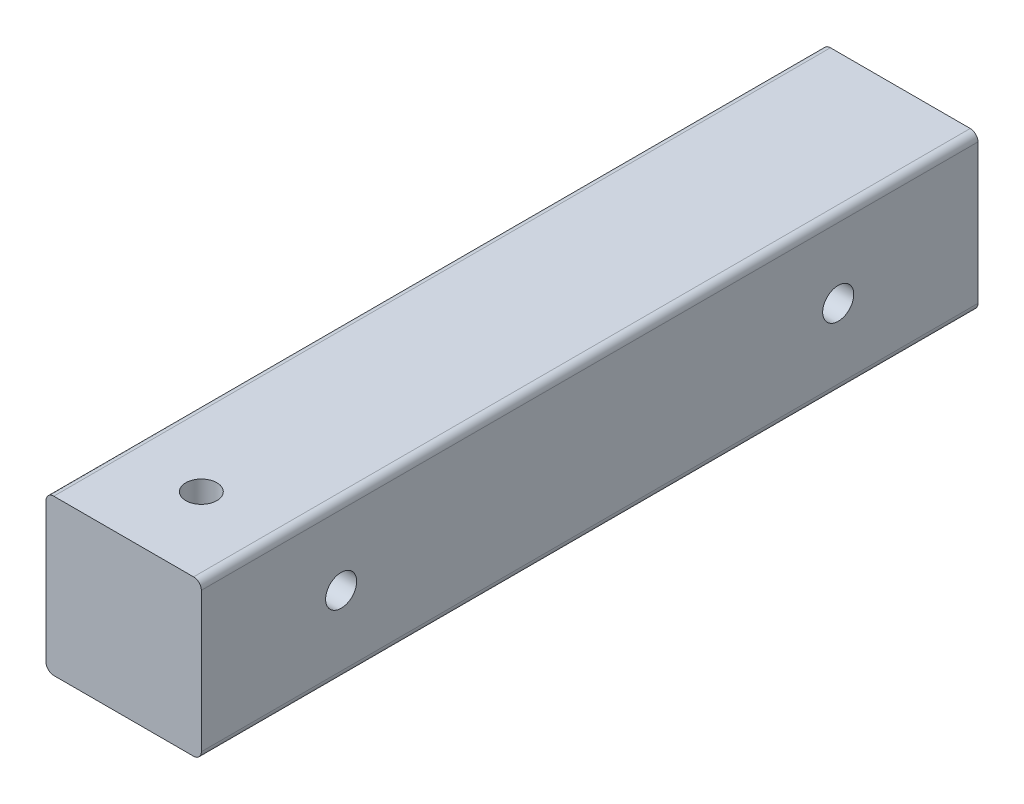
ISO-10303-21;
HEADER;
FILE_DESCRIPTION(('STEP AP214'),'2;1');
FILE_NAME('part.step','',(''),(''),'','','');
FILE_SCHEMA(('AUTOMOTIVE_DESIGN { 1 0 10303 214 1 1 1 1 }'));
ENDSEC;
DATA;
#1=APPLICATION_CONTEXT('core data for automotive mechanical design processes');
#2=APPLICATION_PROTOCOL_DEFINITION('international standard','automotive_design',2000,#1);
#3=PRODUCT_CONTEXT('',#1,'mechanical');
#4=PRODUCT('Part','Part','',(#3));
#5=PRODUCT_RELATED_PRODUCT_CATEGORY('part','',(#4));
#6=PRODUCT_DEFINITION_FORMATION('','',#4);
#7=PRODUCT_DEFINITION_CONTEXT('part definition',#1,'design');
#8=PRODUCT_DEFINITION('design','',#6,#7);
#9=PRODUCT_DEFINITION_SHAPE('','',#8);
#10=(LENGTH_UNIT() NAMED_UNIT(*) SI_UNIT(.MILLI.,.METRE.));
#11=(NAMED_UNIT(*) PLANE_ANGLE_UNIT() SI_UNIT($,.RADIAN.));
#12=(NAMED_UNIT(*) SI_UNIT($,.STERADIAN.) SOLID_ANGLE_UNIT());
#13=UNCERTAINTY_MEASURE_WITH_UNIT(LENGTH_MEASURE(1.E-05),#10,'distance_accuracy_value','');
#14=(GEOMETRIC_REPRESENTATION_CONTEXT(3) GLOBAL_UNCERTAINTY_ASSIGNED_CONTEXT((#13)) GLOBAL_UNIT_ASSIGNED_CONTEXT((#10,
#11,#12)) REPRESENTATION_CONTEXT('',''));
#15=CARTESIAN_POINT('',(0.,0.,0.));
#16=DIRECTION('',(0.,0.,1.));
#17=DIRECTION('',(1.,0.,0.));
#18=AXIS2_PLACEMENT_3D('',#15,#16,#17);
#19=CARTESIAN_POINT('',(0.,0.,100.));
#20=DIRECTION('',(1.,0.,0.));
#21=DIRECTION('',(0.,0.,-1.));
#22=AXIS2_PLACEMENT_3D('',#19,#20,#21);
#23=PLANE('',#22);
#24=CARTESIAN_POINT('',(0.,10.,18.));
#25=DIRECTION('',(1.,0.,0.));
#26=DIRECTION('',(0.,0.,-1.));
#27=AXIS2_PLACEMENT_3D('',#24,#25,#26);
#28=CIRCLE('',#27,2.);
#29=CARTESIAN_POINT('',(0.,10.,16.));
#30=VERTEX_POINT('',#29);
#31=EDGE_CURVE('E135',#30,#30,#28,.T.);
#32=ORIENTED_EDGE('',*,*,#31,.T.);
#33=EDGE_LOOP('',(#32));
#34=FACE_BOUND('',#33,.T.);
#35=CARTESIAN_POINT('',(0.,10.,82.));
#36=DIRECTION('',(1.,0.,0.));
#37=DIRECTION('',(0.,0.,-1.));
#38=AXIS2_PLACEMENT_3D('',#35,#36,#37);
#39=CIRCLE('',#38,2.);
#40=CARTESIAN_POINT('',(0.,10.,80.));
#41=VERTEX_POINT('',#40);
#42=EDGE_CURVE('E213',#41,#41,#39,.T.);
#43=ORIENTED_EDGE('',*,*,#42,.T.);
#44=EDGE_LOOP('',(#43));
#45=FACE_BOUND('',#44,.T.);
#46=DIRECTION('',(0.,-1.,0.));
#47=VECTOR('',#46,1.);
#48=CARTESIAN_POINT('',(0.,0.,100.));
#49=LINE('',#48,#47);
#50=CARTESIAN_POINT('',(0.,19.,100.));
#51=VERTEX_POINT('',#50);
#52=CARTESIAN_POINT('',(0.,1.,100.));
#53=VERTEX_POINT('',#52);
#54=EDGE_CURVE('E126',#51,#53,#49,.T.);
#55=ORIENTED_EDGE('',*,*,#54,.F.);
#56=DIRECTION('',(0.,0.,-1.));
#57=VECTOR('',#56,1.);
#58=CARTESIAN_POINT('',(0.,19.,100.));
#59=LINE('',#58,#57);
#60=CARTESIAN_POINT('',(0.,19.,0.));
#61=VERTEX_POINT('',#60);
#62=EDGE_CURVE('E110',#51,#61,#59,.T.);
#63=ORIENTED_EDGE('',*,*,#62,.T.);
#64=DIRECTION('',(0.,-1.,0.));
#65=VECTOR('',#64,1.);
#66=CARTESIAN_POINT('',(0.,0.,0.));
#67=LINE('',#66,#65);
#68=CARTESIAN_POINT('',(0.,1.,0.));
#69=VERTEX_POINT('',#68);
#70=EDGE_CURVE('E123',#61,#69,#67,.T.);
#71=ORIENTED_EDGE('',*,*,#70,.T.);
#72=DIRECTION('',(0.,0.,-1.));
#73=VECTOR('',#72,1.);
#74=CARTESIAN_POINT('',(0.,1.,100.));
#75=LINE('',#74,#73);
#76=EDGE_CURVE('E129',#69,#53,#75,.F.);
#77=ORIENTED_EDGE('',*,*,#76,.T.);
#78=EDGE_LOOP('',(#55,#63,#71,#77));
#79=FACE_BOUND('',#78,.T.);
#80=ADVANCED_FACE('F39',(#34,#45,#79),#23,.F.);
#81=CARTESIAN_POINT('',(0.,0.,100.));
#82=DIRECTION('',(0.,1.,0.));
#83=DIRECTION('',(0.,0.,1.));
#84=AXIS2_PLACEMENT_3D('',#81,#82,#83);
#85=PLANE('',#84);
#86=CARTESIAN_POINT('',(10.,0.,90.));
#87=DIRECTION('',(0.,-1.,0.));
#88=DIRECTION('',(0.,0.,-1.));
#89=AXIS2_PLACEMENT_3D('',#86,#87,#88);
#90=CIRCLE('',#89,2.);
#91=CARTESIAN_POINT('',(10.,0.,88.));
#92=VERTEX_POINT('',#91);
#93=EDGE_CURVE('E221',#92,#92,#90,.T.);
#94=ORIENTED_EDGE('',*,*,#93,.F.);
#95=EDGE_LOOP('',(#94));
#96=FACE_BOUND('',#95,.T.);
#97=DIRECTION('',(1.,0.,0.));
#98=VECTOR('',#97,1.);
#99=CARTESIAN_POINT('',(0.,0.,0.));
#100=LINE('',#99,#98);
#101=CARTESIAN_POINT('',(1.,0.,0.));
#102=VERTEX_POINT('',#101);
#103=CARTESIAN_POINT('',(19.,0.,0.));
#104=VERTEX_POINT('',#103);
#105=EDGE_CURVE('E134',#102,#104,#100,.T.);
#106=ORIENTED_EDGE('',*,*,#105,.T.);
#107=DIRECTION('',(0.,0.,-1.));
#108=VECTOR('',#107,1.);
#109=CARTESIAN_POINT('',(19.,0.,100.));
#110=LINE('',#109,#108);
#111=CARTESIAN_POINT('',(19.,0.,100.));
#112=VERTEX_POINT('',#111);
#113=EDGE_CURVE('E11',#104,#112,#110,.F.);
#114=ORIENTED_EDGE('',*,*,#113,.T.);
#115=DIRECTION('',(1.,0.,0.));
#116=VECTOR('',#115,1.);
#117=CARTESIAN_POINT('',(0.,0.,100.));
#118=LINE('',#117,#116);
#119=CARTESIAN_POINT('',(1.,0.,100.));
#120=VERTEX_POINT('',#119);
#121=EDGE_CURVE('E191',#120,#112,#118,.T.);
#122=ORIENTED_EDGE('',*,*,#121,.F.);
#123=DIRECTION('',(0.,0.,-1.));
#124=VECTOR('',#123,1.);
#125=CARTESIAN_POINT('',(1.,0.,100.));
#126=LINE('',#125,#124);
#127=EDGE_CURVE('E48',#120,#102,#126,.T.);
#128=ORIENTED_EDGE('',*,*,#127,.T.);
#129=EDGE_LOOP('',(#106,#114,#122,#128));
#130=FACE_BOUND('',#129,.T.);
#131=ADVANCED_FACE('F189',(#96,#130),#85,.F.);
#132=CARTESIAN_POINT('',(20.,0.,100.));
#133=DIRECTION('',(-1.,0.,0.));
#134=DIRECTION('',(0.,0.,1.));
#135=AXIS2_PLACEMENT_3D('',#132,#133,#134);
#136=PLANE('',#135);
#137=CARTESIAN_POINT('',(20.,10.,18.));
#138=DIRECTION('',(1.,0.,0.));
#139=DIRECTION('',(0.,0.,-1.));
#140=AXIS2_PLACEMENT_3D('',#137,#138,#139);
#141=CIRCLE('',#140,2.);
#142=CARTESIAN_POINT('',(20.,10.,16.));
#143=VERTEX_POINT('',#142);
#144=EDGE_CURVE('E143',#143,#143,#141,.T.);
#145=ORIENTED_EDGE('',*,*,#144,.F.);
#146=EDGE_LOOP('',(#145));
#147=FACE_BOUND('',#146,.T.);
#148=CARTESIAN_POINT('',(20.,10.,82.));
#149=DIRECTION('',(1.,0.,0.));
#150=DIRECTION('',(0.,0.,-1.));
#151=AXIS2_PLACEMENT_3D('',#148,#149,#150);
#152=CIRCLE('',#151,2.);
#153=CARTESIAN_POINT('',(20.,10.,80.));
#154=VERTEX_POINT('',#153);
#155=EDGE_CURVE('E209',#154,#154,#152,.T.);
#156=ORIENTED_EDGE('',*,*,#155,.F.);
#157=EDGE_LOOP('',(#156));
#158=FACE_BOUND('',#157,.T.);
#159=DIRECTION('',(0.,1.,0.));
#160=VECTOR('',#159,1.);
#161=CARTESIAN_POINT('',(20.,0.,0.));
#162=LINE('',#161,#160);
#163=CARTESIAN_POINT('',(20.,1.,0.));
#164=VERTEX_POINT('',#163);
#165=CARTESIAN_POINT('',(20.,19.,0.));
#166=VERTEX_POINT('',#165);
#167=EDGE_CURVE('E140',#164,#166,#162,.T.);
#168=ORIENTED_EDGE('',*,*,#167,.T.);
#169=DIRECTION('',(0.,0.,-1.));
#170=VECTOR('',#169,1.);
#171=CARTESIAN_POINT('',(20.,19.,100.));
#172=LINE('',#171,#170);
#173=CARTESIAN_POINT('',(20.,19.,100.));
#174=VERTEX_POINT('',#173);
#175=EDGE_CURVE('E55',#166,#174,#172,.F.);
#176=ORIENTED_EDGE('',*,*,#175,.T.);
#177=DIRECTION('',(0.,1.,0.));
#178=VECTOR('',#177,1.);
#179=CARTESIAN_POINT('',(20.,0.,100.));
#180=LINE('',#179,#178);
#181=CARTESIAN_POINT('',(20.,1.,100.));
#182=VERTEX_POINT('',#181);
#183=EDGE_CURVE('E199',#182,#174,#180,.T.);
#184=ORIENTED_EDGE('',*,*,#183,.F.);
#185=DIRECTION('',(0.,0.,-1.));
#186=VECTOR('',#185,1.);
#187=CARTESIAN_POINT('',(20.,1.,100.));
#188=LINE('',#187,#186);
#189=EDGE_CURVE('E179',#182,#164,#188,.T.);
#190=ORIENTED_EDGE('',*,*,#189,.T.);
#191=EDGE_LOOP('',(#168,#176,#184,#190));
#192=FACE_BOUND('',#191,.T.);
#193=ADVANCED_FACE('F198',(#147,#158,#192),#136,.F.);
#194=CARTESIAN_POINT('',(0.,20.,100.));
#195=DIRECTION('',(0.,-1.,0.));
#196=DIRECTION('',(0.,0.,-1.));
#197=AXIS2_PLACEMENT_3D('',#194,#195,#196);
#198=PLANE('',#197);
#199=CARTESIAN_POINT('',(10.,20.,90.));
#200=DIRECTION('',(0.,-1.,0.));
#201=DIRECTION('',(0.,0.,-1.));
#202=AXIS2_PLACEMENT_3D('',#199,#200,#201);
#203=CIRCLE('',#202,2.);
#204=CARTESIAN_POINT('',(10.,20.,88.));
#205=VERTEX_POINT('',#204);
#206=EDGE_CURVE('E214',#205,#205,#203,.T.);
#207=ORIENTED_EDGE('',*,*,#206,.T.);
#208=EDGE_LOOP('',(#207));
#209=FACE_BOUND('',#208,.T.);
#210=DIRECTION('',(-1.,0.,0.));
#211=VECTOR('',#210,1.);
#212=CARTESIAN_POINT('',(0.,20.,0.));
#213=LINE('',#212,#211);
#214=CARTESIAN_POINT('',(19.,20.,0.));
#215=VERTEX_POINT('',#214);
#216=CARTESIAN_POINT('',(1.,20.,0.));
#217=VERTEX_POINT('',#216);
#218=EDGE_CURVE('E151',#215,#217,#213,.T.);
#219=ORIENTED_EDGE('',*,*,#218,.T.);
#220=DIRECTION('',(0.,0.,-1.));
#221=VECTOR('',#220,1.);
#222=CARTESIAN_POINT('',(1.,20.,100.));
#223=LINE('',#222,#221);
#224=CARTESIAN_POINT('',(1.,20.,100.));
#225=VERTEX_POINT('',#224);
#226=EDGE_CURVE('E111',#217,#225,#223,.F.);
#227=ORIENTED_EDGE('',*,*,#226,.T.);
#228=DIRECTION('',(-1.,0.,0.));
#229=VECTOR('',#228,1.);
#230=CARTESIAN_POINT('',(0.,20.,100.));
#231=LINE('',#230,#229);
#232=CARTESIAN_POINT('',(19.,20.,100.));
#233=VERTEX_POINT('',#232);
#234=EDGE_CURVE('E146',#233,#225,#231,.T.);
#235=ORIENTED_EDGE('',*,*,#234,.F.);
#236=DIRECTION('',(0.,0.,-1.));
#237=VECTOR('',#236,1.);
#238=CARTESIAN_POINT('',(19.,20.,100.));
#239=LINE('',#238,#237);
#240=EDGE_CURVE('E117',#233,#215,#239,.T.);
#241=ORIENTED_EDGE('',*,*,#240,.T.);
#242=EDGE_LOOP('',(#219,#227,#235,#241));
#243=FACE_BOUND('',#242,.T.);
#244=ADVANCED_FACE('F229',(#209,#243),#198,.F.);
#245=CARTESIAN_POINT('',(0.,0.,100.));
#246=DIRECTION('',(0.,0.,-1.));
#247=DIRECTION('',(-1.,0.,0.));
#248=AXIS2_PLACEMENT_3D('',#245,#246,#247);
#249=PLANE('',#248);
#250=ORIENTED_EDGE('',*,*,#234,.T.);
#251=CARTESIAN_POINT('',(1.,19.,100.));
#252=DIRECTION('',(0.,0.,-1.));
#253=DIRECTION('',(-1.,0.,0.));
#254=AXIS2_PLACEMENT_3D('',#251,#252,#253);
#255=CIRCLE('',#254,1.);
#256=EDGE_CURVE('E176',#225,#51,#255,.F.);
#257=ORIENTED_EDGE('',*,*,#256,.T.);
#258=ORIENTED_EDGE('',*,*,#54,.T.);
#259=CARTESIAN_POINT('',(1.,1.,100.));
#260=DIRECTION('',(0.,0.,-1.));
#261=DIRECTION('',(-1.,0.,0.));
#262=AXIS2_PLACEMENT_3D('',#259,#260,#261);
#263=CIRCLE('',#262,1.);
#264=EDGE_CURVE('E168',#53,#120,#263,.F.);
#265=ORIENTED_EDGE('',*,*,#264,.T.);
#266=ORIENTED_EDGE('',*,*,#121,.T.);
#267=CARTESIAN_POINT('',(19.,1.,100.));
#268=DIRECTION('',(0.,0.,-1.));
#269=DIRECTION('',(-1.,0.,0.));
#270=AXIS2_PLACEMENT_3D('',#267,#268,#269);
#271=CIRCLE('',#270,1.);
#272=EDGE_CURVE('E62',#112,#182,#271,.F.);
#273=ORIENTED_EDGE('',*,*,#272,.T.);
#274=ORIENTED_EDGE('',*,*,#183,.T.);
#275=CARTESIAN_POINT('',(19.,19.,100.));
#276=DIRECTION('',(0.,0.,-1.));
#277=DIRECTION('',(-1.,0.,0.));
#278=AXIS2_PLACEMENT_3D('',#275,#276,#277);
#279=CIRCLE('',#278,1.);
#280=EDGE_CURVE('E173',#174,#233,#279,.F.);
#281=ORIENTED_EDGE('',*,*,#280,.T.);
#282=EDGE_LOOP('',(#250,#257,#258,#265,#266,#273,#274,#281));
#283=FACE_BOUND('',#282,.T.);
#284=ADVANCED_FACE('F262',(#283),#249,.F.);
#285=CARTESIAN_POINT('',(0.,0.,0.));
#286=DIRECTION('',(0.,0.,-1.));
#287=DIRECTION('',(-1.,0.,0.));
#288=AXIS2_PLACEMENT_3D('',#285,#286,#287);
#289=PLANE('',#288);
#290=ORIENTED_EDGE('',*,*,#70,.F.);
#291=CARTESIAN_POINT('',(1.,19.,0.));
#292=DIRECTION('',(0.,0.,-1.));
#293=DIRECTION('',(-1.,0.,0.));
#294=AXIS2_PLACEMENT_3D('',#291,#292,#293);
#295=CIRCLE('',#294,1.);
#296=EDGE_CURVE('E106',#61,#217,#295,.T.);
#297=ORIENTED_EDGE('',*,*,#296,.T.);
#298=ORIENTED_EDGE('',*,*,#218,.F.);
#299=CARTESIAN_POINT('',(19.,19.,0.));
#300=DIRECTION('',(0.,0.,-1.));
#301=DIRECTION('',(-1.,0.,0.));
#302=AXIS2_PLACEMENT_3D('',#299,#300,#301);
#303=CIRCLE('',#302,1.);
#304=EDGE_CURVE('E118',#215,#166,#303,.T.);
#305=ORIENTED_EDGE('',*,*,#304,.T.);
#306=ORIENTED_EDGE('',*,*,#167,.F.);
#307=CARTESIAN_POINT('',(19.,1.,0.));
#308=DIRECTION('',(0.,0.,-1.));
#309=DIRECTION('',(-1.,0.,0.));
#310=AXIS2_PLACEMENT_3D('',#307,#308,#309);
#311=CIRCLE('',#310,1.);
#312=EDGE_CURVE('E158',#164,#104,#311,.T.);
#313=ORIENTED_EDGE('',*,*,#312,.T.);
#314=ORIENTED_EDGE('',*,*,#105,.F.);
#315=CARTESIAN_POINT('',(1.,1.,0.));
#316=DIRECTION('',(0.,0.,-1.));
#317=DIRECTION('',(-1.,0.,0.));
#318=AXIS2_PLACEMENT_3D('',#315,#316,#317);
#319=CIRCLE('',#318,1.);
#320=EDGE_CURVE('E128',#102,#69,#319,.T.);
#321=ORIENTED_EDGE('',*,*,#320,.T.);
#322=EDGE_LOOP('',(#290,#297,#298,#305,#306,#313,#314,#321));
#323=FACE_BOUND('',#322,.T.);
#324=ADVANCED_FACE('F131',(#323),#289,.T.);
#325=CARTESIAN_POINT('',(0.,10.,82.));
#326=DIRECTION('',(1.,0.,0.));
#327=DIRECTION('',(0.,0.,-1.));
#328=AXIS2_PLACEMENT_3D('',#325,#326,#327);
#329=CYLINDRICAL_SURFACE('',#328,2.);
#330=ORIENTED_EDGE('',*,*,#42,.F.);
#331=EDGE_LOOP('',(#330));
#332=FACE_BOUND('',#331,.T.);
#333=ORIENTED_EDGE('',*,*,#155,.T.);
#334=EDGE_LOOP('',(#333));
#335=FACE_BOUND('',#334,.T.);
#336=ADVANCED_FACE('F272',(#332,#335),#329,.F.);
#337=CARTESIAN_POINT('',(0.,10.,18.));
#338=DIRECTION('',(1.,0.,0.));
#339=DIRECTION('',(0.,0.,-1.));
#340=AXIS2_PLACEMENT_3D('',#337,#338,#339);
#341=CYLINDRICAL_SURFACE('',#340,2.);
#342=ORIENTED_EDGE('',*,*,#31,.F.);
#343=EDGE_LOOP('',(#342));
#344=FACE_BOUND('',#343,.T.);
#345=ORIENTED_EDGE('',*,*,#144,.T.);
#346=EDGE_LOOP('',(#345));
#347=FACE_BOUND('',#346,.T.);
#348=ADVANCED_FACE('F235',(#344,#347),#341,.F.);
#349=CARTESIAN_POINT('',(10.,20.,90.));
#350=DIRECTION('',(0.,-1.,0.));
#351=DIRECTION('',(0.,0.,-1.));
#352=AXIS2_PLACEMENT_3D('',#349,#350,#351);
#353=CYLINDRICAL_SURFACE('',#352,2.);
#354=ORIENTED_EDGE('',*,*,#206,.F.);
#355=EDGE_LOOP('',(#354));
#356=FACE_BOUND('',#355,.T.);
#357=ORIENTED_EDGE('',*,*,#93,.T.);
#358=EDGE_LOOP('',(#357));
#359=FACE_BOUND('',#358,.T.);
#360=ADVANCED_FACE('F232',(#356,#359),#353,.F.);
#361=CARTESIAN_POINT('',(1.,19.,100.));
#362=DIRECTION('',(0.,0.,-1.));
#363=DIRECTION('',(-1.,0.,0.));
#364=AXIS2_PLACEMENT_3D('',#361,#362,#363);
#365=CYLINDRICAL_SURFACE('',#364,1.);
#366=ORIENTED_EDGE('',*,*,#256,.F.);
#367=ORIENTED_EDGE('',*,*,#226,.F.);
#368=ORIENTED_EDGE('',*,*,#296,.F.);
#369=ORIENTED_EDGE('',*,*,#62,.F.);
#370=EDGE_LOOP('',(#366,#367,#368,#369));
#371=FACE_BOUND('',#370,.T.);
#372=ADVANCED_FACE('F109',(#371),#365,.T.);
#373=CARTESIAN_POINT('',(19.,19.,100.));
#374=DIRECTION('',(0.,0.,-1.));
#375=DIRECTION('',(-1.,0.,0.));
#376=AXIS2_PLACEMENT_3D('',#373,#374,#375);
#377=CYLINDRICAL_SURFACE('',#376,1.);
#378=ORIENTED_EDGE('',*,*,#280,.F.);
#379=ORIENTED_EDGE('',*,*,#175,.F.);
#380=ORIENTED_EDGE('',*,*,#304,.F.);
#381=ORIENTED_EDGE('',*,*,#240,.F.);
#382=EDGE_LOOP('',(#378,#379,#380,#381));
#383=FACE_BOUND('',#382,.T.);
#384=ADVANCED_FACE('F253',(#383),#377,.T.);
#385=CARTESIAN_POINT('',(19.,1.,100.));
#386=DIRECTION('',(0.,0.,-1.));
#387=DIRECTION('',(-1.,0.,0.));
#388=AXIS2_PLACEMENT_3D('',#385,#386,#387);
#389=CYLINDRICAL_SURFACE('',#388,1.);
#390=ORIENTED_EDGE('',*,*,#272,.F.);
#391=ORIENTED_EDGE('',*,*,#113,.F.);
#392=ORIENTED_EDGE('',*,*,#312,.F.);
#393=ORIENTED_EDGE('',*,*,#189,.F.);
#394=EDGE_LOOP('',(#390,#391,#392,#393));
#395=FACE_BOUND('',#394,.T.);
#396=ADVANCED_FACE('F197',(#395),#389,.T.);
#397=CARTESIAN_POINT('',(1.,1.,100.));
#398=DIRECTION('',(0.,0.,-1.));
#399=DIRECTION('',(-1.,0.,0.));
#400=AXIS2_PLACEMENT_3D('',#397,#398,#399);
#401=CYLINDRICAL_SURFACE('',#400,1.);
#402=ORIENTED_EDGE('',*,*,#264,.F.);
#403=ORIENTED_EDGE('',*,*,#76,.F.);
#404=ORIENTED_EDGE('',*,*,#320,.F.);
#405=ORIENTED_EDGE('',*,*,#127,.F.);
#406=EDGE_LOOP('',(#402,#403,#404,#405));
#407=FACE_BOUND('',#406,.T.);
#408=ADVANCED_FACE('F41',(#407),#401,.T.);
#409=CLOSED_SHELL('',(#80,#131,#193,#244,#284,#324,#336,#348,#360,#372,#384,#396,#408));
#410=MANIFOLD_SOLID_BREP('B2',#409);
#411=ADVANCED_BREP_SHAPE_REPRESENTATION('',(#18,#410),#14);
#412=SHAPE_DEFINITION_REPRESENTATION(#9,#411);
ENDSEC;
END-ISO-10303-21;
